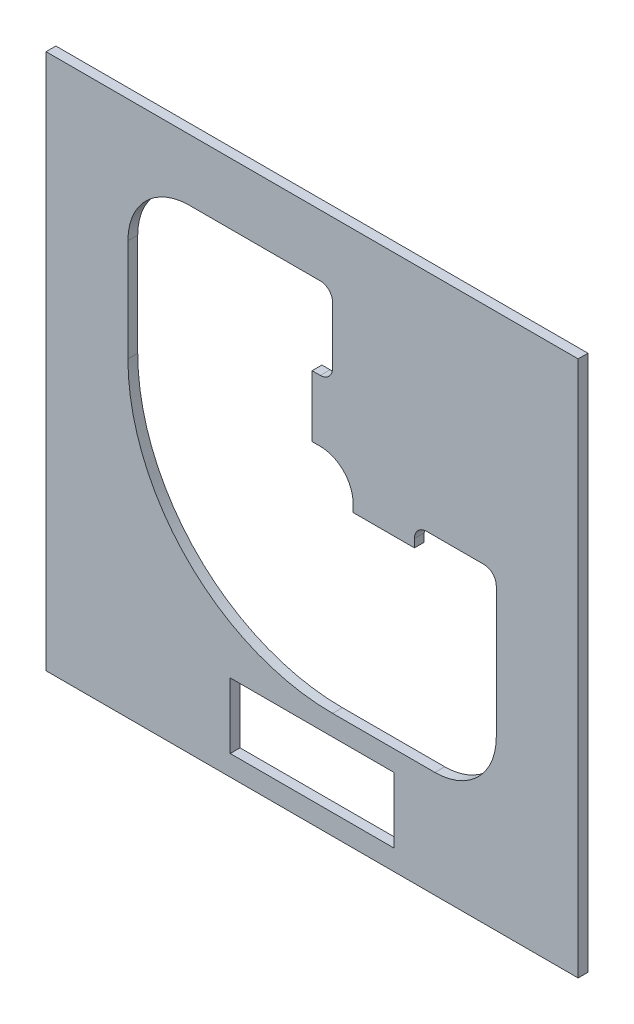
ISO-10303-21;
HEADER;
FILE_DESCRIPTION(('STEP AP214'),'2;1');
FILE_NAME('part.step','',(''),(''),'','','');
FILE_SCHEMA(('AUTOMOTIVE_DESIGN { 1 0 10303 214 1 1 1 1 }'));
ENDSEC;
DATA;
#1=APPLICATION_CONTEXT('core data for automotive mechanical design processes');
#2=APPLICATION_PROTOCOL_DEFINITION('international standard','automotive_design',2000,#1);
#3=PRODUCT_CONTEXT('',#1,'mechanical');
#4=PRODUCT('Part','Part','',(#3));
#5=PRODUCT_RELATED_PRODUCT_CATEGORY('part','',(#4));
#6=PRODUCT_DEFINITION_FORMATION('','',#4);
#7=PRODUCT_DEFINITION_CONTEXT('part definition',#1,'design');
#8=PRODUCT_DEFINITION('design','',#6,#7);
#9=PRODUCT_DEFINITION_SHAPE('','',#8);
#10=(LENGTH_UNIT() NAMED_UNIT(*) SI_UNIT(.MILLI.,.METRE.));
#11=(NAMED_UNIT(*) PLANE_ANGLE_UNIT() SI_UNIT($,.RADIAN.));
#12=(NAMED_UNIT(*) SI_UNIT($,.STERADIAN.) SOLID_ANGLE_UNIT());
#13=UNCERTAINTY_MEASURE_WITH_UNIT(LENGTH_MEASURE(1.E-05),#10,'distance_accuracy_value','');
#14=(GEOMETRIC_REPRESENTATION_CONTEXT(3) GLOBAL_UNCERTAINTY_ASSIGNED_CONTEXT((#13)) GLOBAL_UNIT_ASSIGNED_CONTEXT((#10,
#11,#12)) REPRESENTATION_CONTEXT('',''));
#15=CARTESIAN_POINT('',(0.,0.,0.));
#16=DIRECTION('',(0.,0.,1.));
#17=DIRECTION('',(1.,0.,0.));
#18=AXIS2_PLACEMENT_3D('',#15,#16,#17);
#19=CARTESIAN_POINT('',(0.,0.,0.12));
#20=DIRECTION('',(0.,1.,0.));
#21=DIRECTION('',(-1.,0.,0.));
#22=AXIS2_PLACEMENT_3D('',#19,#20,#21);
#23=PLANE('',#22);
#24=DIRECTION('',(0.,0.,-1.));
#25=VECTOR('',#24,1.);
#26=CARTESIAN_POINT('',(-3.5,0.,0.12));
#27=LINE('',#26,#25);
#28=CARTESIAN_POINT('',(-3.5,0.,0.12));
#29=VERTEX_POINT('',#28);
#30=CARTESIAN_POINT('',(-3.5,0.,-0.12));
#31=VERTEX_POINT('',#30);
#32=EDGE_CURVE('E361',#29,#31,#27,.T.);
#33=ORIENTED_EDGE('',*,*,#32,.F.);
#34=DIRECTION('',(1.,0.,0.));
#35=VECTOR('',#34,1.);
#36=CARTESIAN_POINT('',(0.,0.,0.12));
#37=LINE('',#36,#35);
#38=CARTESIAN_POINT('',(-7.5,0.,0.12));
#39=VERTEX_POINT('',#38);
#40=EDGE_CURVE('E468',#39,#29,#37,.T.);
#41=ORIENTED_EDGE('',*,*,#40,.F.);
#42=DIRECTION('',(0.,0.,-1.));
#43=VECTOR('',#42,1.);
#44=CARTESIAN_POINT('',(-7.5,0.,0.12));
#45=LINE('',#44,#43);
#46=CARTESIAN_POINT('',(-7.5,0.,-0.12));
#47=VERTEX_POINT('',#46);
#48=EDGE_CURVE('E293',#39,#47,#45,.T.);
#49=ORIENTED_EDGE('',*,*,#48,.T.);
#50=DIRECTION('',(1.,0.,0.));
#51=VECTOR('',#50,1.);
#52=CARTESIAN_POINT('',(0.,0.,-0.12));
#53=LINE('',#52,#51);
#54=EDGE_CURVE('E469',#47,#31,#53,.T.);
#55=ORIENTED_EDGE('',*,*,#54,.T.);
#56=EDGE_LOOP('',(#33,#41,#49,#55));
#57=FACE_BOUND('',#56,.T.);
#58=ADVANCED_FACE('F40',(#57),#23,.F.);
#59=CARTESIAN_POINT('',(0.,0.,0.12));
#60=DIRECTION('',(0.,0.,-1.));
#61=DIRECTION('',(-1.,0.,0.));
#62=AXIS2_PLACEMENT_3D('',#59,#60,#61);
#63=PLANE('',#62);
#64=DIRECTION('',(1.,0.,0.));
#65=VECTOR('',#64,1.);
#66=CARTESIAN_POINT('',(-1.,0.5,0.12));
#67=LINE('',#66,#65);
#68=CARTESIAN_POINT('',(-5.,0.499999999999999,0.12));
#69=VERTEX_POINT('',#68);
#70=CARTESIAN_POINT('',(-2.5,0.5,0.12));
#71=VERTEX_POINT('',#70);
#72=EDGE_CURVE('E366',#69,#71,#67,.T.);
#73=ORIENTED_EDGE('',*,*,#72,.F.);
#74=CARTESIAN_POINT('',(-5.,5.5,0.12));
#75=DIRECTION('',(0.,0.,-1.));
#76=DIRECTION('',(-1.,0.,0.));
#77=AXIS2_PLACEMENT_3D('',#74,#75,#76);
#78=CIRCLE('',#77,5.);
#79=CARTESIAN_POINT('',(-10.,5.5,0.12));
#80=VERTEX_POINT('',#79);
#81=EDGE_CURVE('E515',#69,#80,#78,.T.);
#82=ORIENTED_EDGE('',*,*,#81,.T.);
#83=DIRECTION('',(0.,-1.,0.));
#84=VECTOR('',#83,1.);
#85=CARTESIAN_POINT('',(-10.,0.499999999999999,0.12));
#86=LINE('',#85,#84);
#87=CARTESIAN_POINT('',(-10.,8.,0.12));
#88=VERTEX_POINT('',#87);
#89=EDGE_CURVE('E405',#88,#80,#86,.T.);
#90=ORIENTED_EDGE('',*,*,#89,.F.);
#91=CARTESIAN_POINT('',(-8.5,8.,0.12));
#92=DIRECTION('',(0.,0.,-1.));
#93=DIRECTION('',(-1.,0.,0.));
#94=AXIS2_PLACEMENT_3D('',#91,#92,#93);
#95=CIRCLE('',#94,1.5);
#96=CARTESIAN_POINT('',(-8.5,9.5,0.12));
#97=VERTEX_POINT('',#96);
#98=EDGE_CURVE('E494',#88,#97,#95,.T.);
#99=ORIENTED_EDGE('',*,*,#98,.T.);
#100=DIRECTION('',(-1.,0.,0.));
#101=VECTOR('',#100,1.);
#102=CARTESIAN_POINT('',(-5.,9.5,0.12));
#103=LINE('',#102,#101);
#104=CARTESIAN_POINT('',(-5.3,9.5,0.12));
#105=VERTEX_POINT('',#104);
#106=EDGE_CURVE('E402',#105,#97,#103,.T.);
#107=ORIENTED_EDGE('',*,*,#106,.F.);
#108=CARTESIAN_POINT('',(-5.3,9.2,0.12));
#109=DIRECTION('',(0.,0.,-1.));
#110=DIRECTION('',(-1.,0.,0.));
#111=AXIS2_PLACEMENT_3D('',#108,#109,#110);
#112=CIRCLE('',#111,0.3);
#113=CARTESIAN_POINT('',(-5.,9.2,0.12));
#114=VERTEX_POINT('',#113);
#115=EDGE_CURVE('E567',#105,#114,#112,.T.);
#116=ORIENTED_EDGE('',*,*,#115,.T.);
#117=DIRECTION('',(0.,1.,0.));
#118=VECTOR('',#117,1.);
#119=CARTESIAN_POINT('',(-5.,7.5,0.12));
#120=LINE('',#119,#118);
#121=CARTESIAN_POINT('',(-5.,7.8,0.12));
#122=VERTEX_POINT('',#121);
#123=EDGE_CURVE('E398',#122,#114,#120,.T.);
#124=ORIENTED_EDGE('',*,*,#123,.F.);
#125=CARTESIAN_POINT('',(-5.3,7.8,0.12));
#126=DIRECTION('',(0.,0.,-1.));
#127=DIRECTION('',(-1.,0.,0.));
#128=AXIS2_PLACEMENT_3D('',#125,#126,#127);
#129=CIRCLE('',#128,0.3);
#130=CARTESIAN_POINT('',(-5.3,7.5,0.12));
#131=VERTEX_POINT('',#130);
#132=EDGE_CURVE('E561',#122,#131,#129,.T.);
#133=ORIENTED_EDGE('',*,*,#132,.T.);
#134=DIRECTION('',(1.,0.,0.));
#135=VECTOR('',#134,1.);
#136=CARTESIAN_POINT('',(-5.5,7.5,0.12));
#137=LINE('',#136,#135);
#138=CARTESIAN_POINT('',(-5.5,7.5,0.12));
#139=VERTEX_POINT('',#138);
#140=EDGE_CURVE('E394',#139,#131,#137,.T.);
#141=ORIENTED_EDGE('',*,*,#140,.F.);
#142=DIRECTION('',(0.,1.,0.));
#143=VECTOR('',#142,1.);
#144=CARTESIAN_POINT('',(-5.5,6.,0.12));
#145=LINE('',#144,#143);
#146=CARTESIAN_POINT('',(-5.5,6.,0.12));
#147=VERTEX_POINT('',#146);
#148=EDGE_CURVE('E391',#147,#139,#145,.T.);
#149=ORIENTED_EDGE('',*,*,#148,.F.);
#150=DIRECTION('',(-1.,0.,0.));
#151=VECTOR('',#150,1.);
#152=CARTESIAN_POINT('',(-4.5,6.,0.12));
#153=LINE('',#152,#151);
#154=CARTESIAN_POINT('',(-5.3,6.,0.12));
#155=VERTEX_POINT('',#154);
#156=EDGE_CURVE('E388',#155,#147,#153,.T.);
#157=ORIENTED_EDGE('',*,*,#156,.F.);
#158=CARTESIAN_POINT('',(-5.3,5.2,0.12));
#159=DIRECTION('',(0.,0.,-1.));
#160=DIRECTION('',(-1.,0.,0.));
#161=AXIS2_PLACEMENT_3D('',#158,#159,#160);
#162=CIRCLE('',#161,0.8);
#163=CARTESIAN_POINT('',(-4.5,5.2,0.12));
#164=VERTEX_POINT('',#163);
#165=EDGE_CURVE('E11',#155,#164,#162,.T.);
#166=ORIENTED_EDGE('',*,*,#165,.T.);
#167=DIRECTION('',(0.,1.,0.));
#168=VECTOR('',#167,1.);
#169=CARTESIAN_POINT('',(-4.5,5.,0.12));
#170=LINE('',#169,#168);
#171=CARTESIAN_POINT('',(-4.5,5.,0.12));
#172=VERTEX_POINT('',#171);
#173=EDGE_CURVE('E384',#172,#164,#170,.T.);
#174=ORIENTED_EDGE('',*,*,#173,.F.);
#175=DIRECTION('',(-1.,0.,0.));
#176=VECTOR('',#175,1.);
#177=CARTESIAN_POINT('',(-3.,5.,0.12));
#178=LINE('',#177,#176);
#179=CARTESIAN_POINT('',(-3.,5.,0.12));
#180=VERTEX_POINT('',#179);
#181=EDGE_CURVE('E381',#180,#172,#178,.T.);
#182=ORIENTED_EDGE('',*,*,#181,.F.);
#183=DIRECTION('',(0.,-1.,0.));
#184=VECTOR('',#183,1.);
#185=CARTESIAN_POINT('',(-3.,5.5,0.12));
#186=LINE('',#185,#184);
#187=CARTESIAN_POINT('',(-3.,5.2,0.12));
#188=VERTEX_POINT('',#187);
#189=EDGE_CURVE('E378',#188,#180,#186,.T.);
#190=ORIENTED_EDGE('',*,*,#189,.F.);
#191=CARTESIAN_POINT('',(-2.7,5.2,0.12));
#192=DIRECTION('',(0.,0.,-1.));
#193=DIRECTION('',(-1.,0.,0.));
#194=AXIS2_PLACEMENT_3D('',#191,#192,#193);
#195=CIRCLE('',#194,0.3);
#196=CARTESIAN_POINT('',(-2.7,5.5,0.12));
#197=VERTEX_POINT('',#196);
#198=EDGE_CURVE('E555',#188,#197,#195,.T.);
#199=ORIENTED_EDGE('',*,*,#198,.T.);
#200=DIRECTION('',(-1.,0.,0.));
#201=VECTOR('',#200,1.);
#202=CARTESIAN_POINT('',(-3.,5.5,0.12));
#203=LINE('',#202,#201);
#204=CARTESIAN_POINT('',(-1.3,5.5,0.12));
#205=VERTEX_POINT('',#204);
#206=EDGE_CURVE('E374',#205,#197,#203,.T.);
#207=ORIENTED_EDGE('',*,*,#206,.F.);
#208=CARTESIAN_POINT('',(-1.3,5.2,0.12));
#209=DIRECTION('',(0.,0.,-1.));
#210=DIRECTION('',(-1.,0.,0.));
#211=AXIS2_PLACEMENT_3D('',#208,#209,#210);
#212=CIRCLE('',#211,0.3);
#213=CARTESIAN_POINT('',(-1.,5.2,0.12));
#214=VERTEX_POINT('',#213);
#215=EDGE_CURVE('E549',#205,#214,#212,.T.);
#216=ORIENTED_EDGE('',*,*,#215,.T.);
#217=DIRECTION('',(0.,1.,0.));
#218=VECTOR('',#217,1.);
#219=CARTESIAN_POINT('',(-1.,0.5,0.12));
#220=LINE('',#219,#218);
#221=CARTESIAN_POINT('',(-1.,2.,0.12));
#222=VERTEX_POINT('',#221);
#223=EDGE_CURVE('E369',#222,#214,#220,.T.);
#224=ORIENTED_EDGE('',*,*,#223,.F.);
#225=CARTESIAN_POINT('',(-2.5,2.,0.12));
#226=DIRECTION('',(0.,0.,-1.));
#227=DIRECTION('',(-1.,0.,0.));
#228=AXIS2_PLACEMENT_3D('',#225,#226,#227);
#229=CIRCLE('',#228,1.5);
#230=EDGE_CURVE('E501',#222,#71,#229,.T.);
#231=ORIENTED_EDGE('',*,*,#230,.T.);
#232=EDGE_LOOP('',(#73,#82,#90,#99,#107,#116,#124,#133,#141,#149,#157,#166,#174,#182,#190,#199,
#207,#216,#224,#231));
#233=FACE_BOUND('',#232,.T.);
#234=DIRECTION('',(1.,0.,0.));
#235=VECTOR('',#234,1.);
#236=CARTESIAN_POINT('',(0.,-2.1,0.12));
#237=LINE('',#236,#235);
#238=CARTESIAN_POINT('',(-12.,-2.1,0.12));
#239=VERTEX_POINT('',#238);
#240=CARTESIAN_POINT('',(1.,-2.1,0.12));
#241=VERTEX_POINT('',#240);
#242=EDGE_CURVE('E280',#239,#241,#237,.T.);
#243=ORIENTED_EDGE('',*,*,#242,.T.);
#244=DIRECTION('',(0.,1.,0.));
#245=VECTOR('',#244,1.);
#246=CARTESIAN_POINT('',(1.,-2.1,0.12));
#247=LINE('',#246,#245);
#248=CARTESIAN_POINT('',(1.,11.,0.12));
#249=VERTEX_POINT('',#248);
#250=EDGE_CURVE('E285',#241,#249,#247,.T.);
#251=ORIENTED_EDGE('',*,*,#250,.T.);
#252=DIRECTION('',(-1.,0.,0.));
#253=VECTOR('',#252,1.);
#254=CARTESIAN_POINT('',(-11.,11.,0.12));
#255=LINE('',#254,#253);
#256=CARTESIAN_POINT('',(-12.,11.,0.12));
#257=VERTEX_POINT('',#256);
#258=EDGE_CURVE('E465',#249,#257,#255,.T.);
#259=ORIENTED_EDGE('',*,*,#258,.T.);
#260=DIRECTION('',(0.,-1.,0.));
#261=VECTOR('',#260,1.);
#262=CARTESIAN_POINT('',(-12.,11.,0.12));
#263=LINE('',#262,#261);
#264=EDGE_CURVE('E288',#257,#239,#263,.T.);
#265=ORIENTED_EDGE('',*,*,#264,.T.);
#266=EDGE_LOOP('',(#243,#251,#259,#265));
#267=FACE_BOUND('',#266,.T.);
#268=ORIENTED_EDGE('',*,*,#40,.T.);
#269=DIRECTION('',(0.,-1.,0.));
#270=VECTOR('',#269,1.);
#271=CARTESIAN_POINT('',(-3.5,-1.6,0.12));
#272=LINE('',#271,#270);
#273=CARTESIAN_POINT('',(-3.5,-1.6,0.12));
#274=VERTEX_POINT('',#273);
#275=EDGE_CURVE('E330',#29,#274,#272,.T.);
#276=ORIENTED_EDGE('',*,*,#275,.T.);
#277=DIRECTION('',(-1.,0.,0.));
#278=VECTOR('',#277,1.);
#279=CARTESIAN_POINT('',(-3.5,-1.6,0.12));
#280=LINE('',#279,#278);
#281=CARTESIAN_POINT('',(-7.5,-1.6,0.12));
#282=VERTEX_POINT('',#281);
#283=EDGE_CURVE('E333',#274,#282,#280,.T.);
#284=ORIENTED_EDGE('',*,*,#283,.T.);
#285=DIRECTION('',(0.,1.,0.));
#286=VECTOR('',#285,1.);
#287=CARTESIAN_POINT('',(-7.5,0.,0.12));
#288=LINE('',#287,#286);
#289=EDGE_CURVE('E294',#282,#39,#288,.T.);
#290=ORIENTED_EDGE('',*,*,#289,.T.);
#291=EDGE_LOOP('',(#268,#276,#284,#290));
#292=FACE_BOUND('',#291,.T.);
#293=ADVANCED_FACE('F282',(#233,#267,#292),#63,.F.);
#294=CARTESIAN_POINT('',(0.,0.,-0.12));
#295=DIRECTION('',(0.,0.,-1.));
#296=DIRECTION('',(-1.,0.,0.));
#297=AXIS2_PLACEMENT_3D('',#294,#295,#296);
#298=PLANE('',#297);
#299=DIRECTION('',(0.,-1.,0.));
#300=VECTOR('',#299,1.);
#301=CARTESIAN_POINT('',(-3.5,-1.6,-0.12));
#302=LINE('',#301,#300);
#303=CARTESIAN_POINT('',(-3.5,-1.6,-0.12));
#304=VERTEX_POINT('',#303);
#305=EDGE_CURVE('E329',#31,#304,#302,.T.);
#306=ORIENTED_EDGE('',*,*,#305,.F.);
#307=ORIENTED_EDGE('',*,*,#54,.F.);
#308=DIRECTION('',(0.,1.,0.));
#309=VECTOR('',#308,1.);
#310=CARTESIAN_POINT('',(-7.5,0.,-0.12));
#311=LINE('',#310,#309);
#312=CARTESIAN_POINT('',(-7.5,-1.6,-0.12));
#313=VERTEX_POINT('',#312);
#314=EDGE_CURVE('E344',#313,#47,#311,.T.);
#315=ORIENTED_EDGE('',*,*,#314,.F.);
#316=DIRECTION('',(-1.,0.,0.));
#317=VECTOR('',#316,1.);
#318=CARTESIAN_POINT('',(-3.5,-1.6,-0.12));
#319=LINE('',#318,#317);
#320=EDGE_CURVE('E341',#304,#313,#319,.T.);
#321=ORIENTED_EDGE('',*,*,#320,.F.);
#322=EDGE_LOOP('',(#306,#307,#315,#321));
#323=FACE_BOUND('',#322,.T.);
#324=DIRECTION('',(-1.,0.,0.));
#325=VECTOR('',#324,1.);
#326=CARTESIAN_POINT('',(-11.,11.,-0.12));
#327=LINE('',#326,#325);
#328=CARTESIAN_POINT('',(1.,11.,-0.12));
#329=VERTEX_POINT('',#328);
#330=CARTESIAN_POINT('',(-12.,11.,-0.12));
#331=VERTEX_POINT('',#330);
#332=EDGE_CURVE('E464',#329,#331,#327,.T.);
#333=ORIENTED_EDGE('',*,*,#332,.F.);
#334=DIRECTION('',(0.,1.,0.));
#335=VECTOR('',#334,1.);
#336=CARTESIAN_POINT('',(1.,-2.1,-0.12));
#337=LINE('',#336,#335);
#338=CARTESIAN_POINT('',(1.,-2.1,-0.12));
#339=VERTEX_POINT('',#338);
#340=EDGE_CURVE('E310',#339,#329,#337,.T.);
#341=ORIENTED_EDGE('',*,*,#340,.F.);
#342=DIRECTION('',(1.,0.,0.));
#343=VECTOR('',#342,1.);
#344=CARTESIAN_POINT('',(0.,-2.1,-0.12));
#345=LINE('',#344,#343);
#346=CARTESIAN_POINT('',(-12.,-2.1,-0.12));
#347=VERTEX_POINT('',#346);
#348=EDGE_CURVE('E299',#347,#339,#345,.T.);
#349=ORIENTED_EDGE('',*,*,#348,.F.);
#350=DIRECTION('',(0.,-1.,0.));
#351=VECTOR('',#350,1.);
#352=CARTESIAN_POINT('',(-12.,11.,-0.12));
#353=LINE('',#352,#351);
#354=EDGE_CURVE('E304',#331,#347,#353,.T.);
#355=ORIENTED_EDGE('',*,*,#354,.F.);
#356=EDGE_LOOP('',(#333,#341,#349,#355));
#357=FACE_BOUND('',#356,.T.);
#358=DIRECTION('',(0.,1.,0.));
#359=VECTOR('',#358,1.);
#360=CARTESIAN_POINT('',(-5.,7.5,-0.12));
#361=LINE('',#360,#359);
#362=CARTESIAN_POINT('',(-5.,7.8,-0.12));
#363=VERTEX_POINT('',#362);
#364=CARTESIAN_POINT('',(-5.,9.2,-0.12));
#365=VERTEX_POINT('',#364);
#366=EDGE_CURVE('E441',#363,#365,#361,.T.);
#367=ORIENTED_EDGE('',*,*,#366,.T.);
#368=CARTESIAN_POINT('',(-5.3,9.2,-0.12));
#369=DIRECTION('',(0.,0.,-1.));
#370=DIRECTION('',(-1.,0.,0.));
#371=AXIS2_PLACEMENT_3D('',#368,#369,#370);
#372=CIRCLE('',#371,0.3);
#373=CARTESIAN_POINT('',(-5.3,9.5,-0.12));
#374=VERTEX_POINT('',#373);
#375=EDGE_CURVE('E564',#365,#374,#372,.F.);
#376=ORIENTED_EDGE('',*,*,#375,.T.);
#377=DIRECTION('',(-1.,0.,0.));
#378=VECTOR('',#377,1.);
#379=CARTESIAN_POINT('',(-5.,9.5,-0.12));
#380=LINE('',#379,#378);
#381=CARTESIAN_POINT('',(-8.5,9.5,-0.12));
#382=VERTEX_POINT('',#381);
#383=EDGE_CURVE('E445',#374,#382,#380,.T.);
#384=ORIENTED_EDGE('',*,*,#383,.T.);
#385=CARTESIAN_POINT('',(-8.5,8.,-0.12));
#386=DIRECTION('',(0.,0.,-1.));
#387=DIRECTION('',(-1.,0.,0.));
#388=AXIS2_PLACEMENT_3D('',#385,#386,#387);
#389=CIRCLE('',#388,1.5);
#390=CARTESIAN_POINT('',(-10.,8.,-0.12));
#391=VERTEX_POINT('',#390);
#392=EDGE_CURVE('E491',#382,#391,#389,.F.);
#393=ORIENTED_EDGE('',*,*,#392,.T.);
#394=DIRECTION('',(0.,-1.,0.));
#395=VECTOR('',#394,1.);
#396=CARTESIAN_POINT('',(-10.,0.499999999999999,-0.12));
#397=LINE('',#396,#395);
#398=CARTESIAN_POINT('',(-10.,5.5,-0.12));
#399=VERTEX_POINT('',#398);
#400=EDGE_CURVE('E370',#391,#399,#397,.T.);
#401=ORIENTED_EDGE('',*,*,#400,.T.);
#402=CARTESIAN_POINT('',(-5.,5.5,-0.12));
#403=DIRECTION('',(0.,0.,-1.));
#404=DIRECTION('',(-1.,0.,0.));
#405=AXIS2_PLACEMENT_3D('',#402,#403,#404);
#406=CIRCLE('',#405,5.);
#407=CARTESIAN_POINT('',(-5.,0.499999999999999,-0.12));
#408=VERTEX_POINT('',#407);
#409=EDGE_CURVE('E512',#399,#408,#406,.F.);
#410=ORIENTED_EDGE('',*,*,#409,.T.);
#411=DIRECTION('',(1.,0.,0.));
#412=VECTOR('',#411,1.);
#413=CARTESIAN_POINT('',(-1.,0.5,-0.12));
#414=LINE('',#413,#412);
#415=CARTESIAN_POINT('',(-2.5,0.5,-0.12));
#416=VERTEX_POINT('',#415);
#417=EDGE_CURVE('E365',#408,#416,#414,.T.);
#418=ORIENTED_EDGE('',*,*,#417,.T.);
#419=CARTESIAN_POINT('',(-2.5,2.,-0.12));
#420=DIRECTION('',(0.,0.,-1.));
#421=DIRECTION('',(-1.,0.,0.));
#422=AXIS2_PLACEMENT_3D('',#419,#420,#421);
#423=CIRCLE('',#422,1.5);
#424=CARTESIAN_POINT('',(-1.,2.,-0.12));
#425=VERTEX_POINT('',#424);
#426=EDGE_CURVE('E498',#416,#425,#423,.F.);
#427=ORIENTED_EDGE('',*,*,#426,.T.);
#428=DIRECTION('',(0.,1.,0.));
#429=VECTOR('',#428,1.);
#430=CARTESIAN_POINT('',(-1.,0.5,-0.12));
#431=LINE('',#430,#429);
#432=CARTESIAN_POINT('',(-1.,5.2,-0.12));
#433=VERTEX_POINT('',#432);
#434=EDGE_CURVE('E412',#425,#433,#431,.T.);
#435=ORIENTED_EDGE('',*,*,#434,.T.);
#436=CARTESIAN_POINT('',(-1.3,5.2,-0.12));
#437=DIRECTION('',(0.,0.,-1.));
#438=DIRECTION('',(-1.,0.,0.));
#439=AXIS2_PLACEMENT_3D('',#436,#437,#438);
#440=CIRCLE('',#439,0.3);
#441=CARTESIAN_POINT('',(-1.3,5.5,-0.12));
#442=VERTEX_POINT('',#441);
#443=EDGE_CURVE('E546',#433,#442,#440,.F.);
#444=ORIENTED_EDGE('',*,*,#443,.T.);
#445=DIRECTION('',(-1.,0.,0.));
#446=VECTOR('',#445,1.);
#447=CARTESIAN_POINT('',(-3.,5.5,-0.12));
#448=LINE('',#447,#446);
#449=CARTESIAN_POINT('',(-2.7,5.5,-0.12));
#450=VERTEX_POINT('',#449);
#451=EDGE_CURVE('E416',#442,#450,#448,.T.);
#452=ORIENTED_EDGE('',*,*,#451,.T.);
#453=CARTESIAN_POINT('',(-2.7,5.2,-0.12));
#454=DIRECTION('',(0.,0.,-1.));
#455=DIRECTION('',(-1.,0.,0.));
#456=AXIS2_PLACEMENT_3D('',#453,#454,#455);
#457=CIRCLE('',#456,0.3);
#458=CARTESIAN_POINT('',(-3.,5.2,-0.12));
#459=VERTEX_POINT('',#458);
#460=EDGE_CURVE('E552',#450,#459,#457,.F.);
#461=ORIENTED_EDGE('',*,*,#460,.T.);
#462=DIRECTION('',(0.,-1.,0.));
#463=VECTOR('',#462,1.);
#464=CARTESIAN_POINT('',(-3.,5.5,-0.12));
#465=LINE('',#464,#463);
#466=CARTESIAN_POINT('',(-3.,5.,-0.12));
#467=VERTEX_POINT('',#466);
#468=EDGE_CURVE('E420',#459,#467,#465,.T.);
#469=ORIENTED_EDGE('',*,*,#468,.T.);
#470=DIRECTION('',(-1.,0.,0.));
#471=VECTOR('',#470,1.);
#472=CARTESIAN_POINT('',(-3.,5.,-0.12));
#473=LINE('',#472,#471);
#474=CARTESIAN_POINT('',(-4.5,5.,-0.12));
#475=VERTEX_POINT('',#474);
#476=EDGE_CURVE('E423',#467,#475,#473,.T.);
#477=ORIENTED_EDGE('',*,*,#476,.T.);
#478=DIRECTION('',(0.,1.,0.));
#479=VECTOR('',#478,1.);
#480=CARTESIAN_POINT('',(-4.5,5.,-0.12));
#481=LINE('',#480,#479);
#482=CARTESIAN_POINT('',(-4.5,5.2,-0.12));
#483=VERTEX_POINT('',#482);
#484=EDGE_CURVE('E427',#475,#483,#481,.T.);
#485=ORIENTED_EDGE('',*,*,#484,.T.);
#486=CARTESIAN_POINT('',(-5.3,5.2,-0.12));
#487=DIRECTION('',(0.,0.,-1.));
#488=DIRECTION('',(-1.,0.,0.));
#489=AXIS2_PLACEMENT_3D('',#486,#487,#488);
#490=CIRCLE('',#489,0.8);
#491=CARTESIAN_POINT('',(-5.3,6.,-0.12));
#492=VERTEX_POINT('',#491);
#493=EDGE_CURVE('E49',#483,#492,#490,.F.);
#494=ORIENTED_EDGE('',*,*,#493,.T.);
#495=DIRECTION('',(-1.,0.,0.));
#496=VECTOR('',#495,1.);
#497=CARTESIAN_POINT('',(-4.5,6.,-0.12));
#498=LINE('',#497,#496);
#499=CARTESIAN_POINT('',(-5.5,6.,-0.12));
#500=VERTEX_POINT('',#499);
#501=EDGE_CURVE('E430',#492,#500,#498,.T.);
#502=ORIENTED_EDGE('',*,*,#501,.T.);
#503=DIRECTION('',(0.,1.,0.));
#504=VECTOR('',#503,1.);
#505=CARTESIAN_POINT('',(-5.5,6.,-0.12));
#506=LINE('',#505,#504);
#507=CARTESIAN_POINT('',(-5.5,7.5,-0.12));
#508=VERTEX_POINT('',#507);
#509=EDGE_CURVE('E433',#500,#508,#506,.T.);
#510=ORIENTED_EDGE('',*,*,#509,.T.);
#511=DIRECTION('',(1.,0.,0.));
#512=VECTOR('',#511,1.);
#513=CARTESIAN_POINT('',(-5.5,7.5,-0.12));
#514=LINE('',#513,#512);
#515=CARTESIAN_POINT('',(-5.3,7.5,-0.12));
#516=VERTEX_POINT('',#515);
#517=EDGE_CURVE('E437',#508,#516,#514,.T.);
#518=ORIENTED_EDGE('',*,*,#517,.T.);
#519=CARTESIAN_POINT('',(-5.3,7.8,-0.12));
#520=DIRECTION('',(0.,0.,-1.));
#521=DIRECTION('',(-1.,0.,0.));
#522=AXIS2_PLACEMENT_3D('',#519,#520,#521);
#523=CIRCLE('',#522,0.3);
#524=EDGE_CURVE('E558',#516,#363,#523,.F.);
#525=ORIENTED_EDGE('',*,*,#524,.T.);
#526=EDGE_LOOP('',(#367,#376,#384,#393,#401,#410,#418,#427,#435,#444,#452,#461,#469,#477,#485,
#494,#502,#510,#518,#525));
#527=FACE_BOUND('',#526,.T.);
#528=ADVANCED_FACE('F584',(#323,#357,#527),#298,.T.);
#529=CARTESIAN_POINT('',(-11.,11.,0.12));
#530=DIRECTION('',(0.,-1.,0.));
#531=DIRECTION('',(0.,0.,-1.));
#532=AXIS2_PLACEMENT_3D('',#529,#530,#531);
#533=PLANE('',#532);
#534=ORIENTED_EDGE('',*,*,#332,.T.);
#535=DIRECTION('',(0.,0.,-1.));
#536=VECTOR('',#535,1.);
#537=CARTESIAN_POINT('',(-12.,11.,0.12));
#538=LINE('',#537,#536);
#539=EDGE_CURVE('E325',#257,#331,#538,.T.);
#540=ORIENTED_EDGE('',*,*,#539,.F.);
#541=ORIENTED_EDGE('',*,*,#258,.F.);
#542=DIRECTION('',(0.,0.,-1.));
#543=VECTOR('',#542,1.);
#544=CARTESIAN_POINT('',(1.,11.,0.12));
#545=LINE('',#544,#543);
#546=EDGE_CURVE('E305',#249,#329,#545,.T.);
#547=ORIENTED_EDGE('',*,*,#546,.T.);
#548=EDGE_LOOP('',(#534,#540,#541,#547));
#549=FACE_BOUND('',#548,.T.);
#550=ADVANCED_FACE('F611',(#549),#533,.F.);
#551=CARTESIAN_POINT('',(-1.,0.5,0.12));
#552=DIRECTION('',(0.,1.,0.));
#553=DIRECTION('',(-1.,0.,0.));
#554=AXIS2_PLACEMENT_3D('',#551,#552,#553);
#555=PLANE('',#554);
#556=ORIENTED_EDGE('',*,*,#417,.F.);
#557=DIRECTION('',(0.,0.,-1.));
#558=VECTOR('',#557,1.);
#559=CARTESIAN_POINT('',(-5.,0.499999999999999,0.12));
#560=LINE('',#559,#558);
#561=EDGE_CURVE('E509',#408,#69,#560,.F.);
#562=ORIENTED_EDGE('',*,*,#561,.T.);
#563=ORIENTED_EDGE('',*,*,#72,.T.);
#564=DIRECTION('',(0.,0.,-1.));
#565=VECTOR('',#564,1.);
#566=CARTESIAN_POINT('',(-2.5,0.5,-0.12));
#567=LINE('',#566,#565);
#568=EDGE_CURVE('E484',#71,#416,#567,.T.);
#569=ORIENTED_EDGE('',*,*,#568,.T.);
#570=EDGE_LOOP('',(#556,#562,#563,#569));
#571=FACE_BOUND('',#570,.T.);
#572=ADVANCED_FACE('F614',(#571),#555,.T.);
#573=CARTESIAN_POINT('',(-1.,0.5,0.12));
#574=DIRECTION('',(-1.,0.,0.));
#575=DIRECTION('',(0.,0.,1.));
#576=AXIS2_PLACEMENT_3D('',#573,#574,#575);
#577=PLANE('',#576);
#578=ORIENTED_EDGE('',*,*,#223,.T.);
#579=DIRECTION('',(0.,0.,-1.));
#580=VECTOR('',#579,1.);
#581=CARTESIAN_POINT('',(-1.,5.2,-0.12));
#582=LINE('',#581,#580);
#583=EDGE_CURVE('E518',#214,#433,#582,.T.);
#584=ORIENTED_EDGE('',*,*,#583,.T.);
#585=ORIENTED_EDGE('',*,*,#434,.F.);
#586=DIRECTION('',(0.,0.,-1.));
#587=VECTOR('',#586,1.);
#588=CARTESIAN_POINT('',(-1.,2.,0.12));
#589=LINE('',#588,#587);
#590=EDGE_CURVE('E488',#425,#222,#589,.F.);
#591=ORIENTED_EDGE('',*,*,#590,.T.);
#592=EDGE_LOOP('',(#578,#584,#585,#591));
#593=FACE_BOUND('',#592,.T.);
#594=ADVANCED_FACE('F684',(#593),#577,.T.);
#595=CARTESIAN_POINT('',(-3.,5.5,0.12));
#596=DIRECTION('',(0.,-1.,0.));
#597=DIRECTION('',(0.,0.,-1.));
#598=AXIS2_PLACEMENT_3D('',#595,#596,#597);
#599=PLANE('',#598);
#600=ORIENTED_EDGE('',*,*,#451,.F.);
#601=DIRECTION('',(0.,0.,-1.));
#602=VECTOR('',#601,1.);
#603=CARTESIAN_POINT('',(-1.3,5.5,0.12));
#604=LINE('',#603,#602);
#605=EDGE_CURVE('E526',#442,#205,#604,.F.);
#606=ORIENTED_EDGE('',*,*,#605,.T.);
#607=ORIENTED_EDGE('',*,*,#206,.T.);
#608=DIRECTION('',(0.,0.,-1.));
#609=VECTOR('',#608,1.);
#610=CARTESIAN_POINT('',(-2.7,5.5,-0.12));
#611=LINE('',#610,#609);
#612=EDGE_CURVE('E522',#197,#450,#611,.T.);
#613=ORIENTED_EDGE('',*,*,#612,.T.);
#614=EDGE_LOOP('',(#600,#606,#607,#613));
#615=FACE_BOUND('',#614,.T.);
#616=ADVANCED_FACE('F691',(#615),#599,.T.);
#617=CARTESIAN_POINT('',(-3.,5.5,0.12));
#618=DIRECTION('',(1.,0.,0.));
#619=DIRECTION('',(0.,0.,-1.));
#620=AXIS2_PLACEMENT_3D('',#617,#618,#619);
#621=PLANE('',#620);
#622=ORIENTED_EDGE('',*,*,#468,.F.);
#623=DIRECTION('',(0.,0.,-1.));
#624=VECTOR('',#623,1.);
#625=CARTESIAN_POINT('',(-3.,5.2,0.12));
#626=LINE('',#625,#624);
#627=EDGE_CURVE('E529',#459,#188,#626,.F.);
#628=ORIENTED_EDGE('',*,*,#627,.T.);
#629=ORIENTED_EDGE('',*,*,#189,.T.);
#630=DIRECTION('',(0.,0.,-1.));
#631=VECTOR('',#630,1.);
#632=CARTESIAN_POINT('',(-3.,5.,0.12));
#633=LINE('',#632,#631);
#634=EDGE_CURVE('E460',#180,#467,#633,.T.);
#635=ORIENTED_EDGE('',*,*,#634,.T.);
#636=EDGE_LOOP('',(#622,#628,#629,#635));
#637=FACE_BOUND('',#636,.T.);
#638=ADVANCED_FACE('F697',(#637),#621,.T.);
#639=CARTESIAN_POINT('',(-3.,5.,0.12));
#640=DIRECTION('',(0.,-1.,0.));
#641=DIRECTION('',(0.,0.,-1.));
#642=AXIS2_PLACEMENT_3D('',#639,#640,#641);
#643=PLANE('',#642);
#644=ORIENTED_EDGE('',*,*,#476,.F.);
#645=ORIENTED_EDGE('',*,*,#634,.F.);
#646=ORIENTED_EDGE('',*,*,#181,.T.);
#647=DIRECTION('',(0.,0.,-1.));
#648=VECTOR('',#647,1.);
#649=CARTESIAN_POINT('',(-4.5,5.,0.12));
#650=LINE('',#649,#648);
#651=EDGE_CURVE('E457',#172,#475,#650,.T.);
#652=ORIENTED_EDGE('',*,*,#651,.T.);
#653=EDGE_LOOP('',(#644,#645,#646,#652));
#654=FACE_BOUND('',#653,.T.);
#655=ADVANCED_FACE('F589',(#654),#643,.T.);
#656=CARTESIAN_POINT('',(-4.5,5.,0.12));
#657=DIRECTION('',(-1.,0.,0.));
#658=DIRECTION('',(0.,0.,1.));
#659=AXIS2_PLACEMENT_3D('',#656,#657,#658);
#660=PLANE('',#659);
#661=ORIENTED_EDGE('',*,*,#173,.T.);
#662=DIRECTION('',(0.,0.,-1.));
#663=VECTOR('',#662,1.);
#664=CARTESIAN_POINT('',(-4.5,5.2,-0.12));
#665=LINE('',#664,#663);
#666=EDGE_CURVE('E570',#164,#483,#665,.T.);
#667=ORIENTED_EDGE('',*,*,#666,.T.);
#668=ORIENTED_EDGE('',*,*,#484,.F.);
#669=ORIENTED_EDGE('',*,*,#651,.F.);
#670=EDGE_LOOP('',(#661,#667,#668,#669));
#671=FACE_BOUND('',#670,.T.);
#672=ADVANCED_FACE('F579',(#671),#660,.T.);
#673=CARTESIAN_POINT('',(-4.5,6.,0.12));
#674=DIRECTION('',(0.,-1.,0.));
#675=DIRECTION('',(0.,0.,-1.));
#676=AXIS2_PLACEMENT_3D('',#673,#674,#675);
#677=PLANE('',#676);
#678=ORIENTED_EDGE('',*,*,#501,.F.);
#679=DIRECTION('',(0.,0.,-1.));
#680=VECTOR('',#679,1.);
#681=CARTESIAN_POINT('',(-5.3,6.,0.12));
#682=LINE('',#681,#680);
#683=EDGE_CURVE('E59',#492,#155,#682,.F.);
#684=ORIENTED_EDGE('',*,*,#683,.T.);
#685=ORIENTED_EDGE('',*,*,#156,.T.);
#686=DIRECTION('',(0.,0.,-1.));
#687=VECTOR('',#686,1.);
#688=CARTESIAN_POINT('',(-5.5,6.,0.12));
#689=LINE('',#688,#687);
#690=EDGE_CURVE('E453',#147,#500,#689,.T.);
#691=ORIENTED_EDGE('',*,*,#690,.T.);
#692=EDGE_LOOP('',(#678,#684,#685,#691));
#693=FACE_BOUND('',#692,.T.);
#694=ADVANCED_FACE('F655',(#693),#677,.T.);
#695=CARTESIAN_POINT('',(-5.5,6.,0.12));
#696=DIRECTION('',(-1.,0.,0.));
#697=DIRECTION('',(0.,-1.,0.));
#698=AXIS2_PLACEMENT_3D('',#695,#696,#697);
#699=PLANE('',#698);
#700=ORIENTED_EDGE('',*,*,#509,.F.);
#701=ORIENTED_EDGE('',*,*,#690,.F.);
#702=ORIENTED_EDGE('',*,*,#148,.T.);
#703=DIRECTION('',(0.,0.,-1.));
#704=VECTOR('',#703,1.);
#705=CARTESIAN_POINT('',(-5.5,7.5,0.12));
#706=LINE('',#705,#704);
#707=EDGE_CURVE('E409',#139,#508,#706,.T.);
#708=ORIENTED_EDGE('',*,*,#707,.T.);
#709=EDGE_LOOP('',(#700,#701,#702,#708));
#710=FACE_BOUND('',#709,.T.);
#711=ADVANCED_FACE('F653',(#710),#699,.T.);
#712=CARTESIAN_POINT('',(-5.5,7.5,0.12));
#713=DIRECTION('',(0.,1.,0.));
#714=DIRECTION('',(0.,0.,1.));
#715=AXIS2_PLACEMENT_3D('',#712,#713,#714);
#716=PLANE('',#715);
#717=ORIENTED_EDGE('',*,*,#140,.T.);
#718=DIRECTION('',(0.,0.,-1.));
#719=VECTOR('',#718,1.);
#720=CARTESIAN_POINT('',(-5.3,7.5,-0.12));
#721=LINE('',#720,#719);
#722=EDGE_CURVE('E532',#131,#516,#721,.T.);
#723=ORIENTED_EDGE('',*,*,#722,.T.);
#724=ORIENTED_EDGE('',*,*,#517,.F.);
#725=ORIENTED_EDGE('',*,*,#707,.F.);
#726=EDGE_LOOP('',(#717,#723,#724,#725));
#727=FACE_BOUND('',#726,.T.);
#728=ADVANCED_FACE('F649',(#727),#716,.T.);
#729=CARTESIAN_POINT('',(-5.,7.5,0.12));
#730=DIRECTION('',(-1.,0.,0.));
#731=DIRECTION('',(0.,-1.,0.));
#732=AXIS2_PLACEMENT_3D('',#729,#730,#731);
#733=PLANE('',#732);
#734=ORIENTED_EDGE('',*,*,#366,.F.);
#735=DIRECTION('',(0.,0.,-1.));
#736=VECTOR('',#735,1.);
#737=CARTESIAN_POINT('',(-5.,7.8,0.12));
#738=LINE('',#737,#736);
#739=EDGE_CURVE('E540',#363,#122,#738,.F.);
#740=ORIENTED_EDGE('',*,*,#739,.T.);
#741=ORIENTED_EDGE('',*,*,#123,.T.);
#742=DIRECTION('',(0.,0.,-1.));
#743=VECTOR('',#742,1.);
#744=CARTESIAN_POINT('',(-5.,9.2,-0.12));
#745=LINE('',#744,#743);
#746=EDGE_CURVE('E536',#114,#365,#745,.T.);
#747=ORIENTED_EDGE('',*,*,#746,.T.);
#748=EDGE_LOOP('',(#734,#740,#741,#747));
#749=FACE_BOUND('',#748,.T.);
#750=ADVANCED_FACE('F658',(#749),#733,.T.);
#751=CARTESIAN_POINT('',(-5.,9.5,0.12));
#752=DIRECTION('',(0.,-1.,0.));
#753=DIRECTION('',(0.,0.,-1.));
#754=AXIS2_PLACEMENT_3D('',#751,#752,#753);
#755=PLANE('',#754);
#756=ORIENTED_EDGE('',*,*,#383,.F.);
#757=DIRECTION('',(0.,0.,-1.));
#758=VECTOR('',#757,1.);
#759=CARTESIAN_POINT('',(-5.3,9.5,0.12));
#760=LINE('',#759,#758);
#761=EDGE_CURVE('E543',#374,#105,#760,.F.);
#762=ORIENTED_EDGE('',*,*,#761,.T.);
#763=ORIENTED_EDGE('',*,*,#106,.T.);
#764=DIRECTION('',(0.,0.,-1.));
#765=VECTOR('',#764,1.);
#766=CARTESIAN_POINT('',(-8.5,9.5,-0.12));
#767=LINE('',#766,#765);
#768=EDGE_CURVE('E473',#97,#382,#767,.T.);
#769=ORIENTED_EDGE('',*,*,#768,.T.);
#770=EDGE_LOOP('',(#756,#762,#763,#769));
#771=FACE_BOUND('',#770,.T.);
#772=ADVANCED_FACE('F665',(#771),#755,.T.);
#773=CARTESIAN_POINT('',(-10.,0.499999999999999,0.12));
#774=DIRECTION('',(1.,0.,0.));
#775=DIRECTION('',(0.,0.,-1.));
#776=AXIS2_PLACEMENT_3D('',#773,#774,#775);
#777=PLANE('',#776);
#778=ORIENTED_EDGE('',*,*,#89,.T.);
#779=DIRECTION('',(0.,0.,-1.));
#780=VECTOR('',#779,1.);
#781=CARTESIAN_POINT('',(-10.,5.5,-0.12));
#782=LINE('',#781,#780);
#783=EDGE_CURVE('E505',#80,#399,#782,.T.);
#784=ORIENTED_EDGE('',*,*,#783,.T.);
#785=ORIENTED_EDGE('',*,*,#400,.F.);
#786=DIRECTION('',(0.,0.,-1.));
#787=VECTOR('',#786,1.);
#788=CARTESIAN_POINT('',(-10.,8.,0.12));
#789=LINE('',#788,#787);
#790=EDGE_CURVE('E481',#391,#88,#789,.F.);
#791=ORIENTED_EDGE('',*,*,#790,.T.);
#792=EDGE_LOOP('',(#778,#784,#785,#791));
#793=FACE_BOUND('',#792,.T.);
#794=ADVANCED_FACE('F620',(#793),#777,.T.);
#795=CARTESIAN_POINT('',(-8.5,8.,0.12));
#796=DIRECTION('',(0.,0.,1.));
#797=DIRECTION('',(1.,0.,0.));
#798=AXIS2_PLACEMENT_3D('',#795,#796,#797);
#799=CYLINDRICAL_SURFACE('',#798,1.5);
#800=ORIENTED_EDGE('',*,*,#98,.F.);
#801=ORIENTED_EDGE('',*,*,#790,.F.);
#802=ORIENTED_EDGE('',*,*,#392,.F.);
#803=ORIENTED_EDGE('',*,*,#768,.F.);
#804=EDGE_LOOP('',(#800,#801,#802,#803));
#805=FACE_BOUND('',#804,.T.);
#806=ADVANCED_FACE('F616',(#805),#799,.F.);
#807=CARTESIAN_POINT('',(-2.5,2.,0.12));
#808=DIRECTION('',(0.,0.,1.));
#809=DIRECTION('',(1.,0.,0.));
#810=AXIS2_PLACEMENT_3D('',#807,#808,#809);
#811=CYLINDRICAL_SURFACE('',#810,1.5);
#812=ORIENTED_EDGE('',*,*,#230,.F.);
#813=ORIENTED_EDGE('',*,*,#590,.F.);
#814=ORIENTED_EDGE('',*,*,#426,.F.);
#815=ORIENTED_EDGE('',*,*,#568,.F.);
#816=EDGE_LOOP('',(#812,#813,#814,#815));
#817=FACE_BOUND('',#816,.T.);
#818=ADVANCED_FACE('F619',(#817),#811,.F.);
#819=CARTESIAN_POINT('',(-5.,5.5,0.12));
#820=DIRECTION('',(0.,0.,1.));
#821=DIRECTION('',(1.,0.,0.));
#822=AXIS2_PLACEMENT_3D('',#819,#820,#821);
#823=CYLINDRICAL_SURFACE('',#822,5.);
#824=ORIENTED_EDGE('',*,*,#81,.F.);
#825=ORIENTED_EDGE('',*,*,#561,.F.);
#826=ORIENTED_EDGE('',*,*,#409,.F.);
#827=ORIENTED_EDGE('',*,*,#783,.F.);
#828=EDGE_LOOP('',(#824,#825,#826,#827));
#829=FACE_BOUND('',#828,.T.);
#830=ADVANCED_FACE('F624',(#829),#823,.F.);
#831=CARTESIAN_POINT('',(-3.5,-1.6,0.12));
#832=DIRECTION('',(1.,0.,0.));
#833=DIRECTION('',(0.,0.,-1.));
#834=AXIS2_PLACEMENT_3D('',#831,#832,#833);
#835=PLANE('',#834);
#836=ORIENTED_EDGE('',*,*,#305,.T.);
#837=DIRECTION('',(0.,0.,-1.));
#838=VECTOR('',#837,1.);
#839=CARTESIAN_POINT('',(-3.5,-1.6,0.12));
#840=LINE('',#839,#838);
#841=EDGE_CURVE('E357',#274,#304,#840,.T.);
#842=ORIENTED_EDGE('',*,*,#841,.F.);
#843=ORIENTED_EDGE('',*,*,#275,.F.);
#844=ORIENTED_EDGE('',*,*,#32,.T.);
#845=EDGE_LOOP('',(#836,#842,#843,#844));
#846=FACE_BOUND('',#845,.T.);
#847=ADVANCED_FACE('F628',(#846),#835,.F.);
#848=CARTESIAN_POINT('',(-3.5,-1.6,0.12));
#849=DIRECTION('',(0.,-1.,0.));
#850=DIRECTION('',(0.,0.,-1.));
#851=AXIS2_PLACEMENT_3D('',#848,#849,#850);
#852=PLANE('',#851);
#853=ORIENTED_EDGE('',*,*,#320,.T.);
#854=DIRECTION('',(0.,0.,-1.));
#855=VECTOR('',#854,1.);
#856=CARTESIAN_POINT('',(-7.5,-1.6,0.12));
#857=LINE('',#856,#855);
#858=EDGE_CURVE('E353',#282,#313,#857,.T.);
#859=ORIENTED_EDGE('',*,*,#858,.F.);
#860=ORIENTED_EDGE('',*,*,#283,.F.);
#861=ORIENTED_EDGE('',*,*,#841,.T.);
#862=EDGE_LOOP('',(#853,#859,#860,#861));
#863=FACE_BOUND('',#862,.T.);
#864=ADVANCED_FACE('F843',(#863),#852,.F.);
#865=CARTESIAN_POINT('',(-7.5,0.,0.12));
#866=DIRECTION('',(-1.,0.,0.));
#867=DIRECTION('',(0.,0.,1.));
#868=AXIS2_PLACEMENT_3D('',#865,#866,#867);
#869=PLANE('',#868);
#870=ORIENTED_EDGE('',*,*,#314,.T.);
#871=ORIENTED_EDGE('',*,*,#48,.F.);
#872=ORIENTED_EDGE('',*,*,#289,.F.);
#873=ORIENTED_EDGE('',*,*,#858,.T.);
#874=EDGE_LOOP('',(#870,#871,#872,#873));
#875=FACE_BOUND('',#874,.T.);
#876=ADVANCED_FACE('F851',(#875),#869,.F.);
#877=CARTESIAN_POINT('',(0.,-2.1,0.12));
#878=DIRECTION('',(0.,1.,0.));
#879=DIRECTION('',(0.,0.,1.));
#880=AXIS2_PLACEMENT_3D('',#877,#878,#879);
#881=PLANE('',#880);
#882=ORIENTED_EDGE('',*,*,#348,.T.);
#883=DIRECTION('',(0.,0.,-1.));
#884=VECTOR('',#883,1.);
#885=CARTESIAN_POINT('',(1.,-2.1,0.12));
#886=LINE('',#885,#884);
#887=EDGE_CURVE('E297',#241,#339,#886,.T.);
#888=ORIENTED_EDGE('',*,*,#887,.F.);
#889=ORIENTED_EDGE('',*,*,#242,.F.);
#890=DIRECTION('',(0.,0.,-1.));
#891=VECTOR('',#890,1.);
#892=CARTESIAN_POINT('',(-12.,-2.1,0.12));
#893=LINE('',#892,#891);
#894=EDGE_CURVE('E319',#239,#347,#893,.T.);
#895=ORIENTED_EDGE('',*,*,#894,.T.);
#896=EDGE_LOOP('',(#882,#888,#889,#895));
#897=FACE_BOUND('',#896,.T.);
#898=ADVANCED_FACE('F298',(#897),#881,.F.);
#899=CARTESIAN_POINT('',(-12.,11.,0.12));
#900=DIRECTION('',(1.,0.,0.));
#901=DIRECTION('',(0.,1.,0.));
#902=AXIS2_PLACEMENT_3D('',#899,#900,#901);
#903=PLANE('',#902);
#904=ORIENTED_EDGE('',*,*,#354,.T.);
#905=ORIENTED_EDGE('',*,*,#894,.F.);
#906=ORIENTED_EDGE('',*,*,#264,.F.);
#907=ORIENTED_EDGE('',*,*,#539,.T.);
#908=EDGE_LOOP('',(#904,#905,#906,#907));
#909=FACE_BOUND('',#908,.T.);
#910=ADVANCED_FACE('F864',(#909),#903,.F.);
#911=CARTESIAN_POINT('',(1.,-2.1,0.12));
#912=DIRECTION('',(-1.,0.,0.));
#913=DIRECTION('',(0.,0.,1.));
#914=AXIS2_PLACEMENT_3D('',#911,#912,#913);
#915=PLANE('',#914);
#916=ORIENTED_EDGE('',*,*,#340,.T.);
#917=ORIENTED_EDGE('',*,*,#546,.F.);
#918=ORIENTED_EDGE('',*,*,#250,.F.);
#919=ORIENTED_EDGE('',*,*,#887,.T.);
#920=EDGE_LOOP('',(#916,#917,#918,#919));
#921=FACE_BOUND('',#920,.T.);
#922=ADVANCED_FACE('F307',(#921),#915,.F.);
#923=CARTESIAN_POINT('',(-1.3,5.2,0.12));
#924=DIRECTION('',(0.,0.,1.));
#925=DIRECTION('',(1.,0.,0.));
#926=AXIS2_PLACEMENT_3D('',#923,#924,#925);
#927=CYLINDRICAL_SURFACE('',#926,0.3);
#928=ORIENTED_EDGE('',*,*,#215,.F.);
#929=ORIENTED_EDGE('',*,*,#605,.F.);
#930=ORIENTED_EDGE('',*,*,#443,.F.);
#931=ORIENTED_EDGE('',*,*,#583,.F.);
#932=EDGE_LOOP('',(#928,#929,#930,#931));
#933=FACE_BOUND('',#932,.T.);
#934=ADVANCED_FACE('F630',(#933),#927,.F.);
#935=CARTESIAN_POINT('',(-2.7,5.2,0.12));
#936=DIRECTION('',(0.,0.,1.));
#937=DIRECTION('',(1.,0.,0.));
#938=AXIS2_PLACEMENT_3D('',#935,#936,#937);
#939=CYLINDRICAL_SURFACE('',#938,0.3);
#940=ORIENTED_EDGE('',*,*,#198,.F.);
#941=ORIENTED_EDGE('',*,*,#627,.F.);
#942=ORIENTED_EDGE('',*,*,#460,.F.);
#943=ORIENTED_EDGE('',*,*,#612,.F.);
#944=EDGE_LOOP('',(#940,#941,#942,#943));
#945=FACE_BOUND('',#944,.T.);
#946=ADVANCED_FACE('F633',(#945),#939,.F.);
#947=CARTESIAN_POINT('',(-5.3,7.8,0.12));
#948=DIRECTION('',(0.,0.,1.));
#949=DIRECTION('',(1.,0.,0.));
#950=AXIS2_PLACEMENT_3D('',#947,#948,#949);
#951=CYLINDRICAL_SURFACE('',#950,0.3);
#952=ORIENTED_EDGE('',*,*,#132,.F.);
#953=ORIENTED_EDGE('',*,*,#739,.F.);
#954=ORIENTED_EDGE('',*,*,#524,.F.);
#955=ORIENTED_EDGE('',*,*,#722,.F.);
#956=EDGE_LOOP('',(#952,#953,#954,#955));
#957=FACE_BOUND('',#956,.T.);
#958=ADVANCED_FACE('F600',(#957),#951,.F.);
#959=CARTESIAN_POINT('',(-5.3,9.2,0.12));
#960=DIRECTION('',(0.,0.,1.));
#961=DIRECTION('',(1.,0.,0.));
#962=AXIS2_PLACEMENT_3D('',#959,#960,#961);
#963=CYLINDRICAL_SURFACE('',#962,0.3);
#964=ORIENTED_EDGE('',*,*,#115,.F.);
#965=ORIENTED_EDGE('',*,*,#761,.F.);
#966=ORIENTED_EDGE('',*,*,#375,.F.);
#967=ORIENTED_EDGE('',*,*,#746,.F.);
#968=EDGE_LOOP('',(#964,#965,#966,#967));
#969=FACE_BOUND('',#968,.T.);
#970=ADVANCED_FACE('F596',(#969),#963,.F.);
#971=CARTESIAN_POINT('',(-5.3,5.2,0.12));
#972=DIRECTION('',(0.,0.,1.));
#973=DIRECTION('',(1.,0.,0.));
#974=AXIS2_PLACEMENT_3D('',#971,#972,#973);
#975=CYLINDRICAL_SURFACE('',#974,0.8);
#976=ORIENTED_EDGE('',*,*,#165,.F.);
#977=ORIENTED_EDGE('',*,*,#683,.F.);
#978=ORIENTED_EDGE('',*,*,#493,.F.);
#979=ORIENTED_EDGE('',*,*,#666,.F.);
#980=EDGE_LOOP('',(#976,#977,#978,#979));
#981=FACE_BOUND('',#980,.T.);
#982=ADVANCED_FACE('F42',(#981),#975,.F.);
#983=CLOSED_SHELL('',(#58,#293,#528,#550,#572,#594,#616,#638,#655,#672,#694,#711,#728,#750,#772,
#794,#806,#818,#830,#847,#864,#876,#898,#910,#922,#934,#946,#958,#970,#982));
#984=MANIFOLD_SOLID_BREP('B2',#983);
#985=ADVANCED_BREP_SHAPE_REPRESENTATION('',(#18,#984),#14);
#986=SHAPE_DEFINITION_REPRESENTATION(#9,#985);
ENDSEC;
END-ISO-10303-21;
